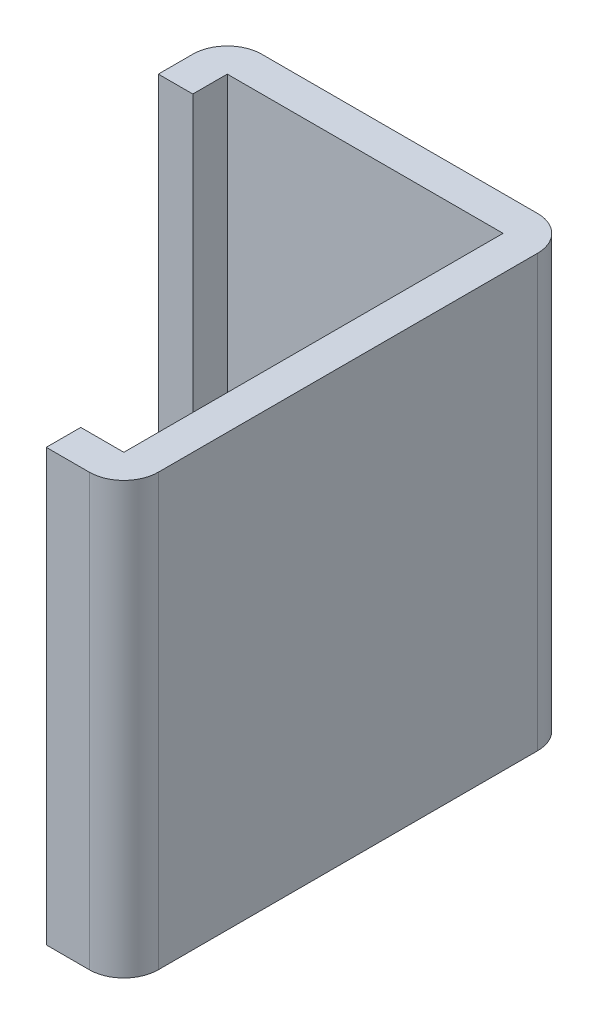
ISO-10303-21;
HEADER;
FILE_DESCRIPTION(('STEP AP214'),'2;1');
FILE_NAME('part.step','',(''),(''),'','','');
FILE_SCHEMA(('AUTOMOTIVE_DESIGN { 1 0 10303 214 1 1 1 1 }'));
ENDSEC;
DATA;
#1=APPLICATION_CONTEXT('core data for automotive mechanical design processes');
#2=APPLICATION_PROTOCOL_DEFINITION('international standard','automotive_design',2000,#1);
#3=PRODUCT_CONTEXT('',#1,'mechanical');
#4=PRODUCT('Part','Part','',(#3));
#5=PRODUCT_RELATED_PRODUCT_CATEGORY('part','',(#4));
#6=PRODUCT_DEFINITION_FORMATION('','',#4);
#7=PRODUCT_DEFINITION_CONTEXT('part definition',#1,'design');
#8=PRODUCT_DEFINITION('design','',#6,#7);
#9=PRODUCT_DEFINITION_SHAPE('','',#8);
#10=(LENGTH_UNIT() NAMED_UNIT(*) SI_UNIT(.MILLI.,.METRE.));
#11=(NAMED_UNIT(*) PLANE_ANGLE_UNIT() SI_UNIT($,.RADIAN.));
#12=(NAMED_UNIT(*) SI_UNIT($,.STERADIAN.) SOLID_ANGLE_UNIT());
#13=UNCERTAINTY_MEASURE_WITH_UNIT(LENGTH_MEASURE(1.E-05),#10,'distance_accuracy_value','');
#14=(GEOMETRIC_REPRESENTATION_CONTEXT(3) GLOBAL_UNCERTAINTY_ASSIGNED_CONTEXT((#13)) GLOBAL_UNIT_ASSIGNED_CONTEXT((#10,
#11,#12)) REPRESENTATION_CONTEXT('',''));
#15=CARTESIAN_POINT('',(0.,0.,0.));
#16=DIRECTION('',(0.,0.,1.));
#17=DIRECTION('',(1.,0.,0.));
#18=AXIS2_PLACEMENT_3D('',#15,#16,#17);
#19=CARTESIAN_POINT('',(0.508,-0.635,1.2192));
#20=DIRECTION('',(1.,0.,0.));
#21=DIRECTION('',(0.,0.,-1.));
#22=AXIS2_PLACEMENT_3D('',#19,#20,#21);
#23=PLANE('',#22);
#24=DIRECTION('',(0.,1.,0.));
#25=VECTOR('',#24,1.);
#26=CARTESIAN_POINT('',(0.508,-0.635,1.3208));
#27=LINE('',#26,#25);
#28=CARTESIAN_POINT('',(0.508,0.635,1.3208));
#29=VERTEX_POINT('',#28);
#30=CARTESIAN_POINT('',(0.508,-0.635,1.3208));
#31=VERTEX_POINT('',#30);
#32=EDGE_CURVE('E158',#29,#31,#27,.F.);
#33=ORIENTED_EDGE('',*,*,#32,.F.);
#34=DIRECTION('',(0.,0.,1.));
#35=VECTOR('',#34,1.);
#36=CARTESIAN_POINT('',(0.508,0.635,0.1016));
#37=LINE('',#36,#35);
#38=CARTESIAN_POINT('',(0.508,0.635,1.2192));
#39=VERTEX_POINT('',#38);
#40=EDGE_CURVE('E127',#39,#29,#37,.T.);
#41=ORIENTED_EDGE('',*,*,#40,.F.);
#42=DIRECTION('',(0.,1.,0.));
#43=VECTOR('',#42,1.);
#44=CARTESIAN_POINT('',(0.508,-0.635,1.2192));
#45=LINE('',#44,#43);
#46=CARTESIAN_POINT('',(0.508,-0.635,1.2192));
#47=VERTEX_POINT('',#46);
#48=EDGE_CURVE('E169',#39,#47,#45,.F.);
#49=ORIENTED_EDGE('',*,*,#48,.T.);
#50=DIRECTION('',(0.,0.,1.));
#51=VECTOR('',#50,1.);
#52=CARTESIAN_POINT('',(0.508,-0.635,0.1016));
#53=LINE('',#52,#51);
#54=EDGE_CURVE('E162',#47,#31,#53,.T.);
#55=ORIENTED_EDGE('',*,*,#54,.T.);
#56=EDGE_LOOP('',(#33,#41,#49,#55));
#57=FACE_BOUND('',#56,.T.);
#58=ADVANCED_FACE('F17',(#57),#23,.F.);
#59=CARTESIAN_POINT('',(0.635,-0.635,1.3208));
#60=DIRECTION('',(0.,0.,1.));
#61=DIRECTION('',(1.,0.,0.));
#62=AXIS2_PLACEMENT_3D('',#59,#60,#61);
#63=PLANE('',#62);
#64=ORIENTED_EDGE('',*,*,#32,.T.);
#65=DIRECTION('',(1.,0.,0.));
#66=VECTOR('',#65,1.);
#67=CARTESIAN_POINT('',(0.635,-0.635,1.3208));
#68=LINE('',#67,#66);
#69=CARTESIAN_POINT('',(0.635,-0.635,1.3208));
#70=VERTEX_POINT('',#69);
#71=EDGE_CURVE('E165',#31,#70,#68,.T.);
#72=ORIENTED_EDGE('',*,*,#71,.T.);
#73=DIRECTION('',(0.,-1.,0.));
#74=VECTOR('',#73,1.);
#75=CARTESIAN_POINT('',(0.635,-0.635,1.3208));
#76=LINE('',#75,#74);
#77=CARTESIAN_POINT('',(0.635,0.635,1.3208));
#78=VERTEX_POINT('',#77);
#79=EDGE_CURVE('E116',#78,#70,#76,.T.);
#80=ORIENTED_EDGE('',*,*,#79,.F.);
#81=DIRECTION('',(1.,0.,0.));
#82=VECTOR('',#81,1.);
#83=CARTESIAN_POINT('',(0.635,0.635,1.3208));
#84=LINE('',#83,#82);
#85=EDGE_CURVE('E97',#29,#78,#84,.T.);
#86=ORIENTED_EDGE('',*,*,#85,.F.);
#87=EDGE_LOOP('',(#64,#72,#80,#86));
#88=FACE_BOUND('',#87,.T.);
#89=ADVANCED_FACE('F389',(#88),#63,.T.);
#90=CARTESIAN_POINT('',(0.635,-0.635,1.2192));
#91=DIRECTION('',(0.,-1.,0.));
#92=DIRECTION('',(0.,0.,-1.));
#93=AXIS2_PLACEMENT_3D('',#90,#91,#92);
#94=CYLINDRICAL_SURFACE('',#93,0.1016);
#95=CARTESIAN_POINT('',(0.635,0.635,1.2192));
#96=DIRECTION('',(0.,-1.,0.));
#97=DIRECTION('',(0.,0.,-1.));
#98=AXIS2_PLACEMENT_3D('',#95,#96,#97);
#99=CIRCLE('',#98,0.1016);
#100=CARTESIAN_POINT('',(0.7366,0.635,1.2192));
#101=VERTEX_POINT('',#100);
#102=EDGE_CURVE('E20',#78,#101,#99,.F.);
#103=ORIENTED_EDGE('',*,*,#102,.F.);
#104=ORIENTED_EDGE('',*,*,#79,.T.);
#105=CARTESIAN_POINT('',(0.635,-0.635,1.2192));
#106=DIRECTION('',(0.,-1.,0.));
#107=DIRECTION('',(0.,0.,-1.));
#108=AXIS2_PLACEMENT_3D('',#105,#106,#107);
#109=CIRCLE('',#108,0.1016);
#110=CARTESIAN_POINT('',(0.7366,-0.635,1.2192));
#111=VERTEX_POINT('',#110);
#112=EDGE_CURVE('E111',#70,#111,#109,.F.);
#113=ORIENTED_EDGE('',*,*,#112,.T.);
#114=DIRECTION('',(0.,1.,0.));
#115=VECTOR('',#114,1.);
#116=CARTESIAN_POINT('',(0.7366,-0.635,1.2192));
#117=LINE('',#116,#115);
#118=EDGE_CURVE('E108',#111,#101,#117,.T.);
#119=ORIENTED_EDGE('',*,*,#118,.T.);
#120=EDGE_LOOP('',(#103,#104,#113,#119));
#121=FACE_BOUND('',#120,.T.);
#122=ADVANCED_FACE('F109',(#121),#94,.T.);
#123=CARTESIAN_POINT('',(0.7366,-0.635,1.2192));
#124=DIRECTION('',(-1.,0.,0.));
#125=DIRECTION('',(0.,0.,1.));
#126=AXIS2_PLACEMENT_3D('',#123,#124,#125);
#127=PLANE('',#126);
#128=DIRECTION('',(0.,-1.,0.));
#129=VECTOR('',#128,1.);
#130=CARTESIAN_POINT('',(0.7366,-0.635,0.1016));
#131=LINE('',#130,#129);
#132=CARTESIAN_POINT('',(0.7366,0.635,0.1016));
#133=VERTEX_POINT('',#132);
#134=CARTESIAN_POINT('',(0.7366,-0.635,0.1016));
#135=VERTEX_POINT('',#134);
#136=EDGE_CURVE('E115',#133,#135,#131,.T.);
#137=ORIENTED_EDGE('',*,*,#136,.F.);
#138=DIRECTION('',(0.,0.,1.));
#139=VECTOR('',#138,1.);
#140=CARTESIAN_POINT('',(0.7366,0.635,0.1016));
#141=LINE('',#140,#139);
#142=EDGE_CURVE('E104',#101,#133,#141,.F.);
#143=ORIENTED_EDGE('',*,*,#142,.F.);
#144=ORIENTED_EDGE('',*,*,#118,.F.);
#145=DIRECTION('',(0.,0.,1.));
#146=VECTOR('',#145,1.);
#147=CARTESIAN_POINT('',(0.7366,-0.635,0.1016));
#148=LINE('',#147,#146);
#149=EDGE_CURVE('E210',#111,#135,#148,.F.);
#150=ORIENTED_EDGE('',*,*,#149,.T.);
#151=EDGE_LOOP('',(#137,#143,#144,#150));
#152=FACE_BOUND('',#151,.T.);
#153=ADVANCED_FACE('F118',(#152),#127,.F.);
#154=CARTESIAN_POINT('',(0.635,-0.635,0.1016));
#155=DIRECTION('',(0.,-1.,0.));
#156=DIRECTION('',(0.,0.,-1.));
#157=AXIS2_PLACEMENT_3D('',#154,#155,#156);
#158=CYLINDRICAL_SURFACE('',#157,0.1016);
#159=CARTESIAN_POINT('',(0.635,0.635,0.1016));
#160=DIRECTION('',(0.,-1.,0.));
#161=DIRECTION('',(0.,0.,-1.));
#162=AXIS2_PLACEMENT_3D('',#159,#160,#161);
#163=CIRCLE('',#162,0.1016);
#164=CARTESIAN_POINT('',(0.635,0.635,0.));
#165=VERTEX_POINT('',#164);
#166=EDGE_CURVE('E120',#133,#165,#163,.F.);
#167=ORIENTED_EDGE('',*,*,#166,.F.);
#168=ORIENTED_EDGE('',*,*,#136,.T.);
#169=CARTESIAN_POINT('',(0.635,-0.635,0.1016));
#170=DIRECTION('',(0.,-1.,0.));
#171=DIRECTION('',(0.,0.,-1.));
#172=AXIS2_PLACEMENT_3D('',#169,#170,#171);
#173=CIRCLE('',#172,0.1016);
#174=CARTESIAN_POINT('',(0.635,-0.635,0.));
#175=VERTEX_POINT('',#174);
#176=EDGE_CURVE('E207',#135,#175,#173,.F.);
#177=ORIENTED_EDGE('',*,*,#176,.T.);
#178=DIRECTION('',(0.,1.,0.));
#179=VECTOR('',#178,1.);
#180=CARTESIAN_POINT('',(0.635,-0.635,0.));
#181=LINE('',#180,#179);
#182=EDGE_CURVE('E153',#175,#165,#181,.T.);
#183=ORIENTED_EDGE('',*,*,#182,.T.);
#184=EDGE_LOOP('',(#167,#168,#177,#183));
#185=FACE_BOUND('',#184,.T.);
#186=ADVANCED_FACE('F277',(#185),#158,.T.);
#187=CARTESIAN_POINT('',(0.635,-0.635,0.));
#188=DIRECTION('',(0.,0.,1.));
#189=DIRECTION('',(1.,0.,0.));
#190=AXIS2_PLACEMENT_3D('',#187,#188,#189);
#191=PLANE('',#190);
#192=DIRECTION('',(0.,-1.,0.));
#193=VECTOR('',#192,1.);
#194=CARTESIAN_POINT('',(-0.1778,-0.635,0.));
#195=LINE('',#194,#193);
#196=CARTESIAN_POINT('',(-0.1778,0.635,0.));
#197=VERTEX_POINT('',#196);
#198=CARTESIAN_POINT('',(-0.1778,-0.635,0.));
#199=VERTEX_POINT('',#198);
#200=EDGE_CURVE('E140',#197,#199,#195,.T.);
#201=ORIENTED_EDGE('',*,*,#200,.F.);
#202=DIRECTION('',(1.,0.,0.));
#203=VECTOR('',#202,1.);
#204=CARTESIAN_POINT('',(0.635,0.635,0.));
#205=LINE('',#204,#203);
#206=EDGE_CURVE('E122',#165,#197,#205,.F.);
#207=ORIENTED_EDGE('',*,*,#206,.F.);
#208=ORIENTED_EDGE('',*,*,#182,.F.);
#209=DIRECTION('',(1.,0.,0.));
#210=VECTOR('',#209,1.);
#211=CARTESIAN_POINT('',(0.635,-0.635,0.));
#212=LINE('',#211,#210);
#213=EDGE_CURVE('E206',#175,#199,#212,.F.);
#214=ORIENTED_EDGE('',*,*,#213,.T.);
#215=EDGE_LOOP('',(#201,#207,#208,#214));
#216=FACE_BOUND('',#215,.T.);
#217=ADVANCED_FACE('F219',(#216),#191,.F.);
#218=CARTESIAN_POINT('',(-0.1778,-0.635,0.1016));
#219=DIRECTION('',(0.,-1.,0.));
#220=DIRECTION('',(0.,0.,-1.));
#221=AXIS2_PLACEMENT_3D('',#218,#219,#220);
#222=CYLINDRICAL_SURFACE('',#221,0.1016);
#223=CARTESIAN_POINT('',(-0.1778,0.635,0.1016));
#224=DIRECTION('',(0.,-1.,0.));
#225=DIRECTION('',(0.,0.,-1.));
#226=AXIS2_PLACEMENT_3D('',#223,#224,#225);
#227=CIRCLE('',#226,0.1016);
#228=CARTESIAN_POINT('',(-0.2794,0.635,0.1016));
#229=VERTEX_POINT('',#228);
#230=EDGE_CURVE('E212',#197,#229,#227,.F.);
#231=ORIENTED_EDGE('',*,*,#230,.F.);
#232=ORIENTED_EDGE('',*,*,#200,.T.);
#233=CARTESIAN_POINT('',(-0.1778,-0.635,0.1016));
#234=DIRECTION('',(0.,-1.,0.));
#235=DIRECTION('',(0.,0.,-1.));
#236=AXIS2_PLACEMENT_3D('',#233,#234,#235);
#237=CIRCLE('',#236,0.1016);
#238=CARTESIAN_POINT('',(-0.2794,-0.635,0.1016));
#239=VERTEX_POINT('',#238);
#240=EDGE_CURVE('E203',#199,#239,#237,.F.);
#241=ORIENTED_EDGE('',*,*,#240,.T.);
#242=DIRECTION('',(0.,1.,0.));
#243=VECTOR('',#242,1.);
#244=CARTESIAN_POINT('',(-0.2794,-0.635,0.1016));
#245=LINE('',#244,#243);
#246=EDGE_CURVE('E137',#239,#229,#245,.T.);
#247=ORIENTED_EDGE('',*,*,#246,.T.);
#248=EDGE_LOOP('',(#231,#232,#241,#247));
#249=FACE_BOUND('',#248,.T.);
#250=ADVANCED_FACE('F223',(#249),#222,.T.);
#251=CARTESIAN_POINT('',(-0.2794,-0.635,0.1016));
#252=DIRECTION('',(1.,0.,0.));
#253=DIRECTION('',(0.,0.,-1.));
#254=AXIS2_PLACEMENT_3D('',#251,#252,#253);
#255=PLANE('',#254);
#256=DIRECTION('',(0.,1.,0.));
#257=VECTOR('',#256,1.);
#258=CARTESIAN_POINT('',(-0.2794,-0.635,0.2032));
#259=LINE('',#258,#257);
#260=CARTESIAN_POINT('',(-0.2794,-0.635,0.2032));
#261=VERTEX_POINT('',#260);
#262=CARTESIAN_POINT('',(-0.2794,0.635,0.2032));
#263=VERTEX_POINT('',#262);
#264=EDGE_CURVE('E136',#261,#263,#259,.T.);
#265=ORIENTED_EDGE('',*,*,#264,.T.);
#266=DIRECTION('',(0.,0.,1.));
#267=VECTOR('',#266,1.);
#268=CARTESIAN_POINT('',(-0.2794,0.635,0.1016));
#269=LINE('',#268,#267);
#270=EDGE_CURVE('E200',#229,#263,#269,.T.);
#271=ORIENTED_EDGE('',*,*,#270,.F.);
#272=ORIENTED_EDGE('',*,*,#246,.F.);
#273=DIRECTION('',(0.,0.,1.));
#274=VECTOR('',#273,1.);
#275=CARTESIAN_POINT('',(-0.2794,-0.635,0.1016));
#276=LINE('',#275,#274);
#277=EDGE_CURVE('E145',#239,#261,#276,.T.);
#278=ORIENTED_EDGE('',*,*,#277,.T.);
#279=EDGE_LOOP('',(#265,#271,#272,#278));
#280=FACE_BOUND('',#279,.T.);
#281=ADVANCED_FACE('F228',(#280),#255,.F.);
#282=CARTESIAN_POINT('',(-0.2794,-0.635,0.2032));
#283=DIRECTION('',(0.,0.,-1.));
#284=DIRECTION('',(-1.,0.,0.));
#285=AXIS2_PLACEMENT_3D('',#282,#283,#284);
#286=PLANE('',#285);
#287=DIRECTION('',(0.,1.,0.));
#288=VECTOR('',#287,1.);
#289=CARTESIAN_POINT('',(-0.1778,-0.635,0.2032));
#290=LINE('',#289,#288);
#291=CARTESIAN_POINT('',(-0.1778,-0.635,0.2032));
#292=VERTEX_POINT('',#291);
#293=CARTESIAN_POINT('',(-0.1778,0.635,0.2032));
#294=VERTEX_POINT('',#293);
#295=EDGE_CURVE('E133',#292,#294,#290,.T.);
#296=ORIENTED_EDGE('',*,*,#295,.T.);
#297=DIRECTION('',(1.,0.,0.));
#298=VECTOR('',#297,1.);
#299=CARTESIAN_POINT('',(0.635,0.635,0.2032));
#300=LINE('',#299,#298);
#301=EDGE_CURVE('E196',#263,#294,#300,.T.);
#302=ORIENTED_EDGE('',*,*,#301,.F.);
#303=ORIENTED_EDGE('',*,*,#264,.F.);
#304=DIRECTION('',(1.,0.,0.));
#305=VECTOR('',#304,1.);
#306=CARTESIAN_POINT('',(0.635,-0.635,0.2032));
#307=LINE('',#306,#305);
#308=EDGE_CURVE('E141',#261,#292,#307,.T.);
#309=ORIENTED_EDGE('',*,*,#308,.T.);
#310=EDGE_LOOP('',(#296,#302,#303,#309));
#311=FACE_BOUND('',#310,.T.);
#312=ADVANCED_FACE('F234',(#311),#286,.F.);
#313=CARTESIAN_POINT('',(-0.1778,-0.635,0.2032));
#314=DIRECTION('',(-1.,0.,0.));
#315=DIRECTION('',(0.,0.,1.));
#316=AXIS2_PLACEMENT_3D('',#313,#314,#315);
#317=PLANE('',#316);
#318=DIRECTION('',(0.,1.,0.));
#319=VECTOR('',#318,1.);
#320=CARTESIAN_POINT('',(-0.1778,-0.635,0.1016));
#321=LINE('',#320,#319);
#322=CARTESIAN_POINT('',(-0.1778,-0.635,0.1016));
#323=VERTEX_POINT('',#322);
#324=CARTESIAN_POINT('',(-0.1778,0.635,0.1016));
#325=VERTEX_POINT('',#324);
#326=EDGE_CURVE('E130',#323,#325,#321,.T.);
#327=ORIENTED_EDGE('',*,*,#326,.T.);
#328=DIRECTION('',(0.,0.,1.));
#329=VECTOR('',#328,1.);
#330=CARTESIAN_POINT('',(-0.1778,0.635,0.1016));
#331=LINE('',#330,#329);
#332=EDGE_CURVE('E199',#294,#325,#331,.F.);
#333=ORIENTED_EDGE('',*,*,#332,.F.);
#334=ORIENTED_EDGE('',*,*,#295,.F.);
#335=DIRECTION('',(0.,0.,1.));
#336=VECTOR('',#335,1.);
#337=CARTESIAN_POINT('',(-0.1778,-0.635,0.1016));
#338=LINE('',#337,#336);
#339=EDGE_CURVE('E144',#292,#323,#338,.F.);
#340=ORIENTED_EDGE('',*,*,#339,.T.);
#341=EDGE_LOOP('',(#327,#333,#334,#340));
#342=FACE_BOUND('',#341,.T.);
#343=ADVANCED_FACE('F239',(#342),#317,.F.);
#344=CARTESIAN_POINT('',(-0.1778,-0.635,0.1016));
#345=DIRECTION('',(0.,0.,-1.));
#346=DIRECTION('',(-1.,0.,0.));
#347=AXIS2_PLACEMENT_3D('',#344,#345,#346);
#348=PLANE('',#347);
#349=DIRECTION('',(0.,1.,0.));
#350=VECTOR('',#349,1.);
#351=CARTESIAN_POINT('',(0.635,-0.635,0.1016));
#352=LINE('',#351,#350);
#353=CARTESIAN_POINT('',(0.635,-0.635,0.1016));
#354=VERTEX_POINT('',#353);
#355=CARTESIAN_POINT('',(0.635,0.635,0.1016));
#356=VERTEX_POINT('',#355);
#357=EDGE_CURVE('E193',#354,#356,#352,.T.);
#358=ORIENTED_EDGE('',*,*,#357,.T.);
#359=DIRECTION('',(1.,0.,0.));
#360=VECTOR('',#359,1.);
#361=CARTESIAN_POINT('',(0.635,0.635,0.1016));
#362=LINE('',#361,#360);
#363=EDGE_CURVE('E185',#325,#356,#362,.T.);
#364=ORIENTED_EDGE('',*,*,#363,.F.);
#365=ORIENTED_EDGE('',*,*,#326,.F.);
#366=DIRECTION('',(1.,0.,0.));
#367=VECTOR('',#366,1.);
#368=CARTESIAN_POINT('',(0.635,-0.635,0.1016));
#369=LINE('',#368,#367);
#370=EDGE_CURVE('E256',#323,#354,#369,.T.);
#371=ORIENTED_EDGE('',*,*,#370,.T.);
#372=EDGE_LOOP('',(#358,#364,#365,#371));
#373=FACE_BOUND('',#372,.T.);
#374=ADVANCED_FACE('F262',(#373),#348,.F.);
#375=CARTESIAN_POINT('',(0.635,0.635,0.1016));
#376=DIRECTION('',(0.,1.,0.));
#377=DIRECTION('',(0.,0.,1.));
#378=AXIS2_PLACEMENT_3D('',#375,#376,#377);
#379=PLANE('',#378);
#380=ORIENTED_EDGE('',*,*,#332,.T.);
#381=ORIENTED_EDGE('',*,*,#363,.T.);
#382=DIRECTION('',(0.,0.,-1.));
#383=VECTOR('',#382,1.);
#384=CARTESIAN_POINT('',(0.635,0.635,0.1016));
#385=LINE('',#384,#383);
#386=CARTESIAN_POINT('',(0.635,0.635,1.2192));
#387=VERTEX_POINT('',#386);
#388=EDGE_CURVE('E180',#356,#387,#385,.F.);
#389=ORIENTED_EDGE('',*,*,#388,.T.);
#390=DIRECTION('',(1.,0.,0.));
#391=VECTOR('',#390,1.);
#392=CARTESIAN_POINT('',(0.635,0.635,1.2192));
#393=LINE('',#392,#391);
#394=EDGE_CURVE('E173',#387,#39,#393,.F.);
#395=ORIENTED_EDGE('',*,*,#394,.T.);
#396=ORIENTED_EDGE('',*,*,#40,.T.);
#397=ORIENTED_EDGE('',*,*,#85,.T.);
#398=ORIENTED_EDGE('',*,*,#102,.T.);
#399=ORIENTED_EDGE('',*,*,#142,.T.);
#400=ORIENTED_EDGE('',*,*,#166,.T.);
#401=ORIENTED_EDGE('',*,*,#206,.T.);
#402=ORIENTED_EDGE('',*,*,#230,.T.);
#403=ORIENTED_EDGE('',*,*,#270,.T.);
#404=ORIENTED_EDGE('',*,*,#301,.T.);
#405=EDGE_LOOP('',(#380,#381,#389,#395,#396,#397,#398,#399,#400,#401,#402,#403,#404));
#406=FACE_BOUND('',#405,.T.);
#407=ADVANCED_FACE('F102',(#406),#379,.T.);
#408=CARTESIAN_POINT('',(0.635,-0.635,1.2192));
#409=DIRECTION('',(0.,0.,1.));
#410=DIRECTION('',(1.,0.,0.));
#411=AXIS2_PLACEMENT_3D('',#408,#409,#410);
#412=PLANE('',#411);
#413=ORIENTED_EDGE('',*,*,#48,.F.);
#414=ORIENTED_EDGE('',*,*,#394,.F.);
#415=DIRECTION('',(0.,1.,0.));
#416=VECTOR('',#415,1.);
#417=CARTESIAN_POINT('',(0.635,-0.635,1.2192));
#418=LINE('',#417,#416);
#419=CARTESIAN_POINT('',(0.635,-0.635,1.2192));
#420=VERTEX_POINT('',#419);
#421=EDGE_CURVE('E26',#387,#420,#418,.F.);
#422=ORIENTED_EDGE('',*,*,#421,.T.);
#423=DIRECTION('',(1.,0.,0.));
#424=VECTOR('',#423,1.);
#425=CARTESIAN_POINT('',(0.635,-0.635,1.2192));
#426=LINE('',#425,#424);
#427=EDGE_CURVE('E34',#420,#47,#426,.F.);
#428=ORIENTED_EDGE('',*,*,#427,.T.);
#429=EDGE_LOOP('',(#413,#414,#422,#428));
#430=FACE_BOUND('',#429,.T.);
#431=ADVANCED_FACE('F292',(#430),#412,.F.);
#432=CARTESIAN_POINT('',(0.635,-0.635,0.1016));
#433=DIRECTION('',(0.,1.,0.));
#434=DIRECTION('',(0.,0.,1.));
#435=AXIS2_PLACEMENT_3D('',#432,#433,#434);
#436=PLANE('',#435);
#437=ORIENTED_EDGE('',*,*,#339,.F.);
#438=ORIENTED_EDGE('',*,*,#308,.F.);
#439=ORIENTED_EDGE('',*,*,#277,.F.);
#440=ORIENTED_EDGE('',*,*,#240,.F.);
#441=ORIENTED_EDGE('',*,*,#213,.F.);
#442=ORIENTED_EDGE('',*,*,#176,.F.);
#443=ORIENTED_EDGE('',*,*,#149,.F.);
#444=ORIENTED_EDGE('',*,*,#112,.F.);
#445=ORIENTED_EDGE('',*,*,#71,.F.);
#446=ORIENTED_EDGE('',*,*,#54,.F.);
#447=ORIENTED_EDGE('',*,*,#427,.F.);
#448=DIRECTION('',(0.,0.,-1.));
#449=VECTOR('',#448,1.);
#450=CARTESIAN_POINT('',(0.635,-0.635,0.1016));
#451=LINE('',#450,#449);
#452=EDGE_CURVE('E11',#420,#354,#451,.T.);
#453=ORIENTED_EDGE('',*,*,#452,.T.);
#454=ORIENTED_EDGE('',*,*,#370,.F.);
#455=EDGE_LOOP('',(#437,#438,#439,#440,#441,#442,#443,#444,#445,#446,#447,#453,#454));
#456=FACE_BOUND('',#455,.T.);
#457=ADVANCED_FACE('F274',(#456),#436,.F.);
#458=CARTESIAN_POINT('',(0.635,-0.635,0.1016));
#459=DIRECTION('',(1.,0.,0.));
#460=DIRECTION('',(0.,0.,-1.));
#461=AXIS2_PLACEMENT_3D('',#458,#459,#460);
#462=PLANE('',#461);
#463=ORIENTED_EDGE('',*,*,#421,.F.);
#464=ORIENTED_EDGE('',*,*,#388,.F.);
#465=ORIENTED_EDGE('',*,*,#357,.F.);
#466=ORIENTED_EDGE('',*,*,#452,.F.);
#467=EDGE_LOOP('',(#463,#464,#465,#466));
#468=FACE_BOUND('',#467,.T.);
#469=ADVANCED_FACE('F269',(#468),#462,.F.);
#470=CLOSED_SHELL('',(#58,#89,#122,#153,#186,#217,#250,#281,#312,#343,#374,#407,#431,#457,#469));
#471=MANIFOLD_SOLID_BREP('B1',#470);
#472=ADVANCED_BREP_SHAPE_REPRESENTATION('',(#18,#471),#14);
#473=SHAPE_DEFINITION_REPRESENTATION(#9,#472);
ENDSEC;
END-ISO-10303-21;
